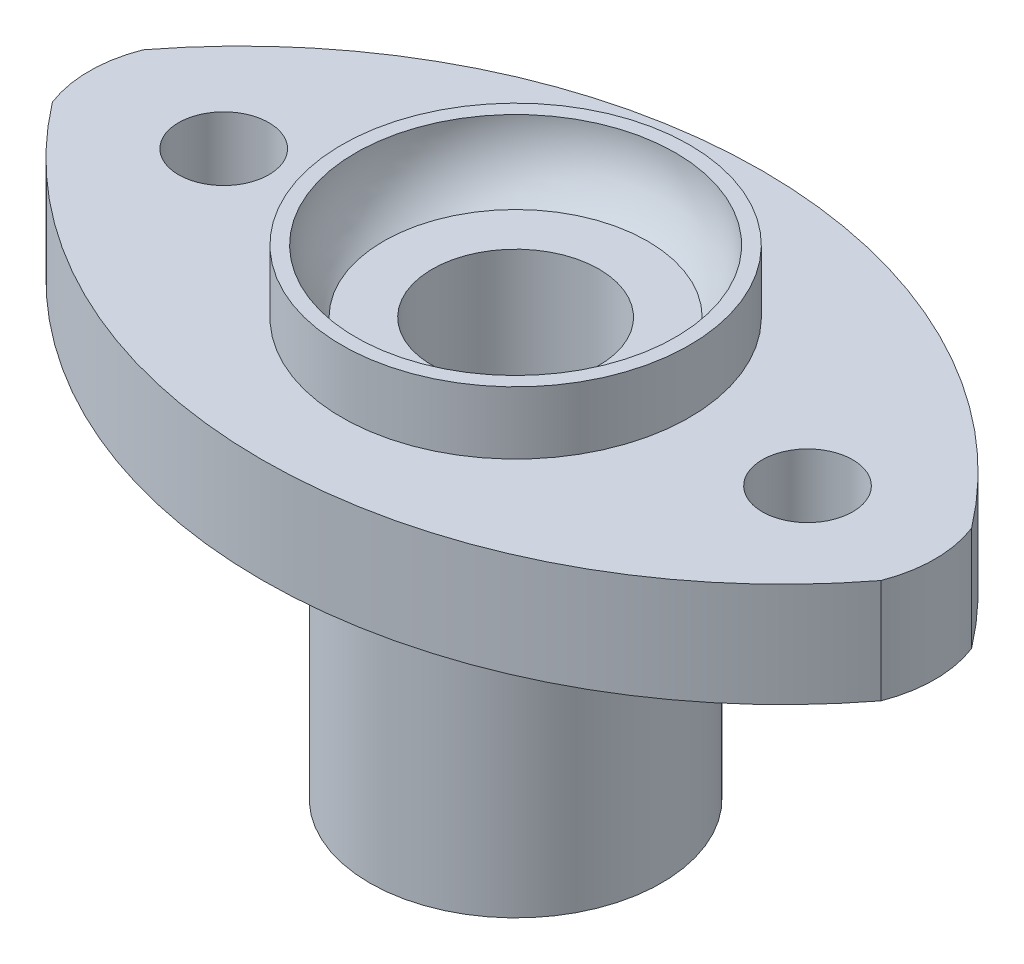
ISO-10303-21;
HEADER;
FILE_DESCRIPTION(('STEP AP214'),'2;1');
FILE_NAME('part.step','',(''),(''),'','','');
FILE_SCHEMA(('AUTOMOTIVE_DESIGN { 1 0 10303 214 1 1 1 1 }'));
ENDSEC;
DATA;
#1=APPLICATION_CONTEXT('core data for automotive mechanical design processes');
#2=APPLICATION_PROTOCOL_DEFINITION('international standard','automotive_design',2000,#1);
#3=PRODUCT_CONTEXT('',#1,'mechanical');
#4=PRODUCT('Part','Part','',(#3));
#5=PRODUCT_RELATED_PRODUCT_CATEGORY('part','',(#4));
#6=PRODUCT_DEFINITION_FORMATION('','',#4);
#7=PRODUCT_DEFINITION_CONTEXT('part definition',#1,'design');
#8=PRODUCT_DEFINITION('design','',#6,#7);
#9=PRODUCT_DEFINITION_SHAPE('','',#8);
#10=(LENGTH_UNIT() NAMED_UNIT(*) SI_UNIT(.MILLI.,.METRE.));
#11=(NAMED_UNIT(*) PLANE_ANGLE_UNIT() SI_UNIT($,.RADIAN.));
#12=(NAMED_UNIT(*) SI_UNIT($,.STERADIAN.) SOLID_ANGLE_UNIT());
#13=UNCERTAINTY_MEASURE_WITH_UNIT(LENGTH_MEASURE(1.E-05),#10,'distance_accuracy_value','');
#14=(GEOMETRIC_REPRESENTATION_CONTEXT(3) GLOBAL_UNCERTAINTY_ASSIGNED_CONTEXT((#13)) GLOBAL_UNIT_ASSIGNED_CONTEXT((#10,
#11,#12)) REPRESENTATION_CONTEXT('',''));
#15=CARTESIAN_POINT('',(0.,0.,0.));
#16=DIRECTION('',(0.,0.,1.));
#17=DIRECTION('',(1.,0.,0.));
#18=AXIS2_PLACEMENT_3D('',#15,#16,#17);
#19=CARTESIAN_POINT('',(0.,0.,0.));
#20=DIRECTION('',(0.,-1.,0.));
#21=DIRECTION('',(0.,0.,-1.));
#22=AXIS2_PLACEMENT_3D('',#19,#20,#21);
#23=CYLINDRICAL_SURFACE('',#22,21.);
#24=CARTESIAN_POINT('',(0.,0.,0.));
#25=DIRECTION('',(0.,-1.,0.));
#26=DIRECTION('',(0.,0.,-1.));
#27=AXIS2_PLACEMENT_3D('',#24,#25,#26);
#28=CIRCLE('',#27,21.);
#29=CARTESIAN_POINT('',(0.,0.,-21.));
#30=VERTEX_POINT('',#29);
#31=EDGE_CURVE('E244',#30,#30,#28,.T.);
#32=ORIENTED_EDGE('',*,*,#31,.F.);
#33=EDGE_LOOP('',(#32));
#34=FACE_BOUND('',#33,.T.);
#35=CARTESIAN_POINT('',(0.,45.,0.));
#36=DIRECTION('',(0.,1.,0.));
#37=DIRECTION('',(0.,0.,1.));
#38=AXIS2_PLACEMENT_3D('',#35,#36,#37);
#39=CIRCLE('',#38,21.);
#40=CARTESIAN_POINT('',(0.,45.,21.));
#41=VERTEX_POINT('',#40);
#42=EDGE_CURVE('E43',#41,#41,#39,.F.);
#43=ORIENTED_EDGE('',*,*,#42,.T.);
#44=EDGE_LOOP('',(#43));
#45=FACE_BOUND('',#44,.T.);
#46=ADVANCED_FACE('F39',(#34,#45),#23,.T.);
#47=CARTESIAN_POINT('',(0.,0.,0.));
#48=DIRECTION('',(0.,-1.,0.));
#49=DIRECTION('',(0.,0.,-1.));
#50=AXIS2_PLACEMENT_3D('',#47,#48,#49);
#51=CYLINDRICAL_SURFACE('',#50,12.);
#52=CARTESIAN_POINT('',(0.,2.41154273188004,0.));
#53=DIRECTION('',(0.,-1.,0.));
#54=DIRECTION('',(0.,0.,-1.));
#55=AXIS2_PLACEMENT_3D('',#52,#53,#54);
#56=CIRCLE('',#55,12.);
#57=CARTESIAN_POINT('',(0.,2.41154273188004,-12.));
#58=VERTEX_POINT('',#57);
#59=EDGE_CURVE('E242',#58,#58,#56,.T.);
#60=ORIENTED_EDGE('',*,*,#59,.T.);
#61=EDGE_LOOP('',(#60));
#62=FACE_BOUND('',#61,.T.);
#63=CARTESIAN_POINT('',(0.,60.,0.));
#64=DIRECTION('',(0.,-1.,0.));
#65=DIRECTION('',(0.,0.,-1.));
#66=AXIS2_PLACEMENT_3D('',#63,#64,#65);
#67=CIRCLE('',#66,12.);
#68=CARTESIAN_POINT('',(0.,60.,-12.));
#69=VERTEX_POINT('',#68);
#70=EDGE_CURVE('E112',#69,#69,#67,.T.);
#71=ORIENTED_EDGE('',*,*,#70,.F.);
#72=EDGE_LOOP('',(#71));
#73=FACE_BOUND('',#72,.T.);
#74=ADVANCED_FACE('F41',(#62,#73),#51,.F.);
#75=CARTESIAN_POINT('',(-0.51993579417514,45.,-39.));
#76=DIRECTION('',(0.,1.,0.));
#77=DIRECTION('',(0.,0.,1.));
#78=AXIS2_PLACEMENT_3D('',#75,#76,#77);
#79=CYLINDRICAL_SURFACE('',#78,75.);
#80=CARTESIAN_POINT('',(-0.51993579417514,60.,-39.));
#81=DIRECTION('',(0.,-1.,0.));
#82=DIRECTION('',(0.,0.,1.));
#83=AXIS2_PLACEMENT_3D('',#80,#81,#82);
#84=CIRCLE('',#83,75.);
#85=CARTESIAN_POINT('',(59.0853595801591,60.,6.52151978282758));
#86=VERTEX_POINT('',#85);
#87=CARTESIAN_POINT('',(-60.1252311685094,60.,6.52151978282756));
#88=VERTEX_POINT('',#87);
#89=EDGE_CURVE('E81',#86,#88,#84,.T.);
#90=ORIENTED_EDGE('',*,*,#89,.T.);
#91=DIRECTION('',(0.,1.,0.));
#92=VECTOR('',#91,1.);
#93=CARTESIAN_POINT('',(-60.1252311685094,45.,6.52151978282756));
#94=LINE('',#93,#92);
#95=CARTESIAN_POINT('',(-60.1252311685094,45.,6.52151978282756));
#96=VERTEX_POINT('',#95);
#97=EDGE_CURVE('E105',#96,#88,#94,.T.);
#98=ORIENTED_EDGE('',*,*,#97,.F.);
#99=CARTESIAN_POINT('',(-0.51993579417514,45.,-39.));
#100=DIRECTION('',(0.,-1.,0.));
#101=DIRECTION('',(0.,0.,1.));
#102=AXIS2_PLACEMENT_3D('',#99,#100,#101);
#103=CIRCLE('',#102,75.);
#104=CARTESIAN_POINT('',(59.0853595801591,45.,6.52151978282758));
#105=VERTEX_POINT('',#104);
#106=EDGE_CURVE('E58',#105,#96,#103,.T.);
#107=ORIENTED_EDGE('',*,*,#106,.F.);
#108=DIRECTION('',(0.,1.,0.));
#109=VECTOR('',#108,1.);
#110=CARTESIAN_POINT('',(59.0853595801591,45.,6.52151978282758));
#111=LINE('',#110,#109);
#112=EDGE_CURVE('E101',#105,#86,#111,.T.);
#113=ORIENTED_EDGE('',*,*,#112,.T.);
#114=EDGE_LOOP('',(#90,#98,#107,#113));
#115=FACE_BOUND('',#114,.T.);
#116=ADVANCED_FACE('F149',(#115),#79,.T.);
#117=CARTESIAN_POINT('',(42.3082984631998,45.,0.));
#118=DIRECTION('',(0.,1.,0.));
#119=DIRECTION('',(0.,0.,1.));
#120=AXIS2_PLACEMENT_3D('',#117,#118,#119);
#121=CYLINDRICAL_SURFACE('',#120,18.);
#122=CARTESIAN_POINT('',(42.3082984631998,60.,0.));
#123=DIRECTION('',(0.,-1.,0.));
#124=DIRECTION('',(0.,0.,-1.));
#125=AXIS2_PLACEMENT_3D('',#122,#123,#124);
#126=CIRCLE('',#125,18.);
#127=CARTESIAN_POINT('',(59.0853595801591,60.,-6.52151978282758));
#128=VERTEX_POINT('',#127);
#129=EDGE_CURVE('E75',#128,#86,#126,.T.);
#130=ORIENTED_EDGE('',*,*,#129,.T.);
#131=ORIENTED_EDGE('',*,*,#112,.F.);
#132=CARTESIAN_POINT('',(42.3082984631998,45.,0.));
#133=DIRECTION('',(0.,-1.,0.));
#134=DIRECTION('',(0.,0.,-1.));
#135=AXIS2_PLACEMENT_3D('',#132,#133,#134);
#136=CIRCLE('',#135,18.);
#137=CARTESIAN_POINT('',(59.0853595801591,45.,-6.52151978282758));
#138=VERTEX_POINT('',#137);
#139=EDGE_CURVE('E92',#138,#105,#136,.T.);
#140=ORIENTED_EDGE('',*,*,#139,.F.);
#141=DIRECTION('',(0.,1.,0.));
#142=VECTOR('',#141,1.);
#143=CARTESIAN_POINT('',(59.0853595801591,45.,-6.52151978282758));
#144=LINE('',#143,#142);
#145=EDGE_CURVE('E97',#138,#128,#144,.T.);
#146=ORIENTED_EDGE('',*,*,#145,.T.);
#147=EDGE_LOOP('',(#130,#131,#140,#146));
#148=FACE_BOUND('',#147,.T.);
#149=ADVANCED_FACE('F103',(#148),#121,.T.);
#150=CARTESIAN_POINT('',(-0.51993579417514,45.,39.));
#151=DIRECTION('',(0.,1.,0.));
#152=DIRECTION('',(0.,0.,1.));
#153=AXIS2_PLACEMENT_3D('',#150,#151,#152);
#154=CYLINDRICAL_SURFACE('',#153,75.);
#155=CARTESIAN_POINT('',(-0.51993579417514,60.,39.));
#156=DIRECTION('',(0.,-1.,0.));
#157=DIRECTION('',(0.,0.,-1.));
#158=AXIS2_PLACEMENT_3D('',#155,#156,#157);
#159=CIRCLE('',#158,75.);
#160=CARTESIAN_POINT('',(-60.1252311685094,60.,-6.52151978282758));
#161=VERTEX_POINT('',#160);
#162=EDGE_CURVE('E99',#161,#128,#159,.T.);
#163=ORIENTED_EDGE('',*,*,#162,.T.);
#164=ORIENTED_EDGE('',*,*,#145,.F.);
#165=CARTESIAN_POINT('',(-0.51993579417514,45.,39.));
#166=DIRECTION('',(0.,-1.,0.));
#167=DIRECTION('',(0.,0.,-1.));
#168=AXIS2_PLACEMENT_3D('',#165,#166,#167);
#169=CIRCLE('',#168,75.);
#170=CARTESIAN_POINT('',(-60.1252311685094,45.,-6.52151978282758));
#171=VERTEX_POINT('',#170);
#172=EDGE_CURVE('E89',#171,#138,#169,.T.);
#173=ORIENTED_EDGE('',*,*,#172,.F.);
#174=DIRECTION('',(0.,1.,0.));
#175=VECTOR('',#174,1.);
#176=CARTESIAN_POINT('',(-60.1252311685094,45.,-6.52151978282758));
#177=LINE('',#176,#175);
#178=EDGE_CURVE('E100',#171,#161,#177,.T.);
#179=ORIENTED_EDGE('',*,*,#178,.T.);
#180=EDGE_LOOP('',(#163,#164,#173,#179));
#181=FACE_BOUND('',#180,.T.);
#182=ADVANCED_FACE('F98',(#181),#154,.T.);
#183=CARTESIAN_POINT('',(-43.3481700515501,45.,0.));
#184=DIRECTION('',(0.,1.,0.));
#185=DIRECTION('',(0.,0.,1.));
#186=AXIS2_PLACEMENT_3D('',#183,#184,#185);
#187=CYLINDRICAL_SURFACE('',#186,18.);
#188=CARTESIAN_POINT('',(-43.3481700515501,60.,0.));
#189=DIRECTION('',(0.,-1.,0.));
#190=DIRECTION('',(0.,0.,1.));
#191=AXIS2_PLACEMENT_3D('',#188,#189,#190);
#192=CIRCLE('',#191,18.);
#193=EDGE_CURVE('E109',#88,#161,#192,.T.);
#194=ORIENTED_EDGE('',*,*,#193,.T.);
#195=ORIENTED_EDGE('',*,*,#178,.F.);
#196=CARTESIAN_POINT('',(-43.3481700515501,45.,0.));
#197=DIRECTION('',(0.,-1.,0.));
#198=DIRECTION('',(0.,0.,1.));
#199=AXIS2_PLACEMENT_3D('',#196,#197,#198);
#200=CIRCLE('',#199,18.);
#201=EDGE_CURVE('E94',#96,#171,#200,.T.);
#202=ORIENTED_EDGE('',*,*,#201,.F.);
#203=ORIENTED_EDGE('',*,*,#97,.T.);
#204=EDGE_LOOP('',(#194,#195,#202,#203));
#205=FACE_BOUND('',#204,.T.);
#206=ADVANCED_FACE('F155',(#205),#187,.T.);
#207=CARTESIAN_POINT('',(-21.9340529228626,60.,-19.5));
#208=DIRECTION('',(0.,1.,0.));
#209=DIRECTION('',(0.,0.,1.));
#210=AXIS2_PLACEMENT_3D('',#207,#208,#209);
#211=PLANE('',#210);
#212=CARTESIAN_POINT('',(-42.,60.,0.));
#213=DIRECTION('',(0.,1.,0.));
#214=DIRECTION('',(0.,0.,1.));
#215=AXIS2_PLACEMENT_3D('',#212,#213,#214);
#216=CIRCLE('',#215,6.5);
#217=CARTESIAN_POINT('',(-42.,60.,6.5));
#218=VERTEX_POINT('',#217);
#219=EDGE_CURVE('E246',#218,#218,#216,.T.);
#220=ORIENTED_EDGE('',*,*,#219,.F.);
#221=EDGE_LOOP('',(#220));
#222=FACE_BOUND('',#221,.T.);
#223=CARTESIAN_POINT('',(42.,60.,0.));
#224=DIRECTION('',(0.,1.,0.));
#225=DIRECTION('',(0.,0.,1.));
#226=AXIS2_PLACEMENT_3D('',#223,#224,#225);
#227=CIRCLE('',#226,6.5);
#228=CARTESIAN_POINT('',(42.,60.,6.5));
#229=VERTEX_POINT('',#228);
#230=EDGE_CURVE('E254',#229,#229,#227,.T.);
#231=ORIENTED_EDGE('',*,*,#230,.F.);
#232=EDGE_LOOP('',(#231));
#233=FACE_BOUND('',#232,.T.);
#234=CARTESIAN_POINT('',(0.,60.,0.));
#235=DIRECTION('',(0.,-1.,0.));
#236=DIRECTION('',(0.,0.,-1.));
#237=AXIS2_PLACEMENT_3D('',#234,#235,#236);
#238=CIRCLE('',#237,25.);
#239=CARTESIAN_POINT('',(0.,60.,-25.));
#240=VERTEX_POINT('',#239);
#241=EDGE_CURVE('E119',#240,#240,#238,.T.);
#242=ORIENTED_EDGE('',*,*,#241,.T.);
#243=EDGE_LOOP('',(#242));
#244=FACE_BOUND('',#243,.T.);
#245=ORIENTED_EDGE('',*,*,#193,.F.);
#246=ORIENTED_EDGE('',*,*,#89,.F.);
#247=ORIENTED_EDGE('',*,*,#129,.F.);
#248=ORIENTED_EDGE('',*,*,#162,.F.);
#249=EDGE_LOOP('',(#245,#246,#247,#248));
#250=FACE_BOUND('',#249,.T.);
#251=ADVANCED_FACE('F139',(#222,#233,#244,#250),#211,.T.);
#252=CARTESIAN_POINT('',(-21.9340529228626,45.,-19.5));
#253=DIRECTION('',(0.,1.,0.));
#254=DIRECTION('',(0.,0.,1.));
#255=AXIS2_PLACEMENT_3D('',#252,#253,#254);
#256=PLANE('',#255);
#257=CARTESIAN_POINT('',(-42.,45.,0.));
#258=DIRECTION('',(0.,1.,0.));
#259=DIRECTION('',(0.,0.,1.));
#260=AXIS2_PLACEMENT_3D('',#257,#258,#259);
#261=CIRCLE('',#260,6.5);
#262=CARTESIAN_POINT('',(-42.,45.,6.5));
#263=VERTEX_POINT('',#262);
#264=EDGE_CURVE('E251',#263,#263,#261,.T.);
#265=ORIENTED_EDGE('',*,*,#264,.T.);
#266=EDGE_LOOP('',(#265));
#267=FACE_BOUND('',#266,.T.);
#268=CARTESIAN_POINT('',(42.,45.,0.));
#269=DIRECTION('',(0.,1.,0.));
#270=DIRECTION('',(0.,0.,1.));
#271=AXIS2_PLACEMENT_3D('',#268,#269,#270);
#272=CIRCLE('',#271,6.5);
#273=CARTESIAN_POINT('',(42.,45.,6.5));
#274=VERTEX_POINT('',#273);
#275=EDGE_CURVE('E257',#274,#274,#272,.T.);
#276=ORIENTED_EDGE('',*,*,#275,.T.);
#277=EDGE_LOOP('',(#276));
#278=FACE_BOUND('',#277,.T.);
#279=ORIENTED_EDGE('',*,*,#42,.F.);
#280=EDGE_LOOP('',(#279));
#281=FACE_BOUND('',#280,.T.);
#282=ORIENTED_EDGE('',*,*,#201,.T.);
#283=ORIENTED_EDGE('',*,*,#172,.T.);
#284=ORIENTED_EDGE('',*,*,#139,.T.);
#285=ORIENTED_EDGE('',*,*,#106,.T.);
#286=EDGE_LOOP('',(#282,#283,#284,#285));
#287=FACE_BOUND('',#286,.T.);
#288=ADVANCED_FACE('F90',(#267,#278,#281,#287),#256,.F.);
#289=CARTESIAN_POINT('',(0.,68.9582668114332,0.));
#290=DIRECTION('',(0.,-1.,0.));
#291=DIRECTION('',(0.,0.,-1.));
#292=AXIS2_PLACEMENT_3D('',#289,#290,#291);
#293=DEGENERATE_TOROIDAL_SURFACE('',#292,11.0000725693456,12.,.T.);
#294=CARTESIAN_POINT('',(0.,60.,0.));
#295=DIRECTION('',(0.,1.,0.));
#296=DIRECTION('',(0.,0.,1.));
#297=AXIS2_PLACEMENT_3D('',#294,#295,#296);
#298=CIRCLE('',#297,18.9843981974231);
#299=CARTESIAN_POINT('',(0.,60.,18.9843981974231));
#300=VERTEX_POINT('',#299);
#301=EDGE_CURVE('E11',#300,#300,#298,.T.);
#302=ORIENTED_EDGE('',*,*,#301,.F.);
#303=EDGE_LOOP('',(#302));
#304=FACE_BOUND('',#303,.T.);
#305=CARTESIAN_POINT('',(0.,69.,0.));
#306=DIRECTION('',(0.,-1.,0.));
#307=DIRECTION('',(0.,0.,-1.));
#308=AXIS2_PLACEMENT_3D('',#305,#306,#307);
#309=CIRCLE('',#308,23.);
#310=CARTESIAN_POINT('',(0.,69.,-23.));
#311=VERTEX_POINT('',#310);
#312=EDGE_CURVE('E49',#311,#311,#309,.T.);
#313=ORIENTED_EDGE('',*,*,#312,.F.);
#314=EDGE_LOOP('',(#313));
#315=FACE_BOUND('',#314,.T.);
#316=ADVANCED_FACE('F130',(#304,#315),#293,.F.);
#317=CARTESIAN_POINT('',(25.,69.,0.));
#318=DIRECTION('',(0.,1.,0.));
#319=DIRECTION('',(0.,0.,1.));
#320=AXIS2_PLACEMENT_3D('',#317,#318,#319);
#321=PLANE('',#320);
#322=ORIENTED_EDGE('',*,*,#312,.T.);
#323=EDGE_LOOP('',(#322));
#324=FACE_BOUND('',#323,.T.);
#325=CARTESIAN_POINT('',(0.,69.,0.));
#326=DIRECTION('',(0.,-1.,0.));
#327=DIRECTION('',(0.,0.,-1.));
#328=AXIS2_PLACEMENT_3D('',#325,#326,#327);
#329=CIRCLE('',#328,25.);
#330=CARTESIAN_POINT('',(0.,69.,-25.));
#331=VERTEX_POINT('',#330);
#332=EDGE_CURVE('E122',#331,#331,#329,.T.);
#333=ORIENTED_EDGE('',*,*,#332,.F.);
#334=EDGE_LOOP('',(#333));
#335=FACE_BOUND('',#334,.T.);
#336=ADVANCED_FACE('F127',(#324,#335),#321,.T.);
#337=CARTESIAN_POINT('',(0.,0.,0.));
#338=DIRECTION('',(0.,-1.,0.));
#339=DIRECTION('',(0.,0.,-1.));
#340=AXIS2_PLACEMENT_3D('',#337,#338,#339);
#341=CYLINDRICAL_SURFACE('',#340,25.);
#342=ORIENTED_EDGE('',*,*,#332,.T.);
#343=EDGE_LOOP('',(#342));
#344=FACE_BOUND('',#343,.T.);
#345=ORIENTED_EDGE('',*,*,#241,.F.);
#346=EDGE_LOOP('',(#345));
#347=FACE_BOUND('',#346,.T.);
#348=ADVANCED_FACE('F137',(#344,#347),#341,.T.);
#349=ORIENTED_EDGE('',*,*,#301,.T.);
#350=EDGE_LOOP('',(#349));
#351=FACE_BOUND('',#350,.T.);
#352=ORIENTED_EDGE('',*,*,#70,.T.);
#353=EDGE_LOOP('',(#352));
#354=FACE_BOUND('',#353,.T.);
#355=ADVANCED_FACE('F158',(#351,#354),#211,.T.);
#356=CARTESIAN_POINT('',(42.,60.,0.));
#357=DIRECTION('',(0.,1.,0.));
#358=DIRECTION('',(0.,0.,1.));
#359=AXIS2_PLACEMENT_3D('',#356,#357,#358);
#360=CYLINDRICAL_SURFACE('',#359,6.5);
#361=ORIENTED_EDGE('',*,*,#275,.F.);
#362=EDGE_LOOP('',(#361));
#363=FACE_BOUND('',#362,.T.);
#364=ORIENTED_EDGE('',*,*,#230,.T.);
#365=EDGE_LOOP('',(#364));
#366=FACE_BOUND('',#365,.T.);
#367=ADVANCED_FACE('F163',(#363,#366),#360,.F.);
#368=CARTESIAN_POINT('',(-42.,60.,0.));
#369=DIRECTION('',(0.,1.,0.));
#370=DIRECTION('',(0.,0.,1.));
#371=AXIS2_PLACEMENT_3D('',#368,#369,#370);
#372=CYLINDRICAL_SURFACE('',#371,6.5);
#373=ORIENTED_EDGE('',*,*,#264,.F.);
#374=EDGE_LOOP('',(#373));
#375=FACE_BOUND('',#374,.T.);
#376=ORIENTED_EDGE('',*,*,#219,.T.);
#377=EDGE_LOOP('',(#376));
#378=FACE_BOUND('',#377,.T.);
#379=ADVANCED_FACE('F206',(#375,#378),#372,.F.);
#380=CARTESIAN_POINT('',(0.,0.,0.));
#381=DIRECTION('',(0.,-1.,0.));
#382=DIRECTION('',(0.,0.,-1.));
#383=AXIS2_PLACEMENT_3D('',#380,#381,#382);
#384=CONICAL_SURFACE('',#383,21.,1.30899693899575);
#385=ORIENTED_EDGE('',*,*,#59,.F.);
#386=EDGE_LOOP('',(#385));
#387=FACE_BOUND('',#386,.T.);
#388=ORIENTED_EDGE('',*,*,#31,.T.);
#389=EDGE_LOOP('',(#388));
#390=FACE_BOUND('',#389,.T.);
#391=ADVANCED_FACE('F216',(#387,#390),#384,.F.);
#392=CLOSED_SHELL('',(#46,#74,#116,#149,#182,#206,#251,#288,#316,#336,#348,#355,#367,#379,#391));
#393=MANIFOLD_SOLID_BREP('B2',#392);
#394=ADVANCED_BREP_SHAPE_REPRESENTATION('',(#18,#393),#14);
#395=SHAPE_DEFINITION_REPRESENTATION(#9,#394);
ENDSEC;
END-ISO-10303-21;
